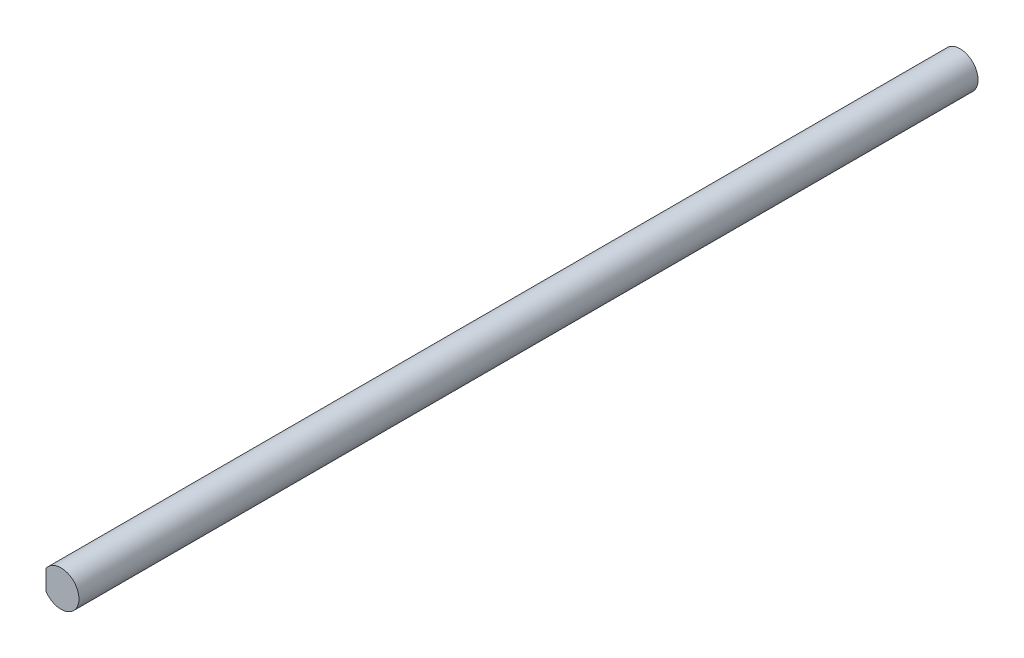
ISO-10303-21;
HEADER;
FILE_DESCRIPTION(('STEP AP214'),'2;1');
FILE_NAME('part.step','',(''),(''),'','','');
FILE_SCHEMA(('AUTOMOTIVE_DESIGN { 1 0 10303 214 1 1 1 1 }'));
ENDSEC;
DATA;
#1=APPLICATION_CONTEXT('core data for automotive mechanical design processes');
#2=APPLICATION_PROTOCOL_DEFINITION('international standard','automotive_design',2000,#1);
#3=PRODUCT_CONTEXT('',#1,'mechanical');
#4=PRODUCT('Part','Part','',(#3));
#5=PRODUCT_RELATED_PRODUCT_CATEGORY('part','',(#4));
#6=PRODUCT_DEFINITION_FORMATION('','',#4);
#7=PRODUCT_DEFINITION_CONTEXT('part definition',#1,'design');
#8=PRODUCT_DEFINITION('design','',#6,#7);
#9=PRODUCT_DEFINITION_SHAPE('','',#8);
#10=(LENGTH_UNIT() NAMED_UNIT(*) SI_UNIT(.MILLI.,.METRE.));
#11=(NAMED_UNIT(*) PLANE_ANGLE_UNIT() SI_UNIT($,.RADIAN.));
#12=(NAMED_UNIT(*) SI_UNIT($,.STERADIAN.) SOLID_ANGLE_UNIT());
#13=UNCERTAINTY_MEASURE_WITH_UNIT(LENGTH_MEASURE(1.E-05),#10,'distance_accuracy_value','');
#14=(GEOMETRIC_REPRESENTATION_CONTEXT(3) GLOBAL_UNCERTAINTY_ASSIGNED_CONTEXT((#13)) GLOBAL_UNIT_ASSIGNED_CONTEXT((#10,
#11,#12)) REPRESENTATION_CONTEXT('',''));
#15=CARTESIAN_POINT('',(0.,0.,0.));
#16=DIRECTION('',(0.,0.,1.));
#17=DIRECTION('',(1.,0.,0.));
#18=AXIS2_PLACEMENT_3D('',#15,#16,#17);
#19=CARTESIAN_POINT('',(0.,0.,150.));
#20=DIRECTION('',(0.,0.,-1.));
#21=DIRECTION('',(-1.,0.,0.));
#22=AXIS2_PLACEMENT_3D('',#19,#20,#21);
#23=CYLINDRICAL_SURFACE('',#22,3.);
#24=CARTESIAN_POINT('',(0.,0.,0.));
#25=DIRECTION('',(0.,0.,1.));
#26=DIRECTION('',(1.,0.,0.));
#27=AXIS2_PLACEMENT_3D('',#24,#25,#26);
#28=CIRCLE('',#27,3.);
#29=CARTESIAN_POINT('',(-2.5,-1.6583123951777,0.));
#30=VERTEX_POINT('',#29);
#31=CARTESIAN_POINT('',(-2.5,1.6583123951777,0.));
#32=VERTEX_POINT('',#31);
#33=EDGE_CURVE('E70',#30,#32,#28,.T.);
#34=ORIENTED_EDGE('',*,*,#33,.T.);
#35=DIRECTION('',(0.,0.,-1.));
#36=VECTOR('',#35,1.);
#37=CARTESIAN_POINT('',(-2.5,1.6583123951777,150.));
#38=LINE('',#37,#36);
#39=CARTESIAN_POINT('',(-2.5,1.6583123951777,150.));
#40=VERTEX_POINT('',#39);
#41=EDGE_CURVE('E11',#40,#32,#38,.T.);
#42=ORIENTED_EDGE('',*,*,#41,.F.);
#43=CARTESIAN_POINT('',(0.,0.,150.));
#44=DIRECTION('',(0.,0.,1.));
#45=DIRECTION('',(1.,0.,0.));
#46=AXIS2_PLACEMENT_3D('',#43,#44,#45);
#47=CIRCLE('',#46,3.);
#48=CARTESIAN_POINT('',(-2.5,-1.6583123951777,150.));
#49=VERTEX_POINT('',#48);
#50=EDGE_CURVE('E69',#49,#40,#47,.T.);
#51=ORIENTED_EDGE('',*,*,#50,.F.);
#52=DIRECTION('',(0.,0.,-1.));
#53=VECTOR('',#52,1.);
#54=CARTESIAN_POINT('',(-2.5,-1.6583123951777,150.));
#55=LINE('',#54,#53);
#56=EDGE_CURVE('E46',#49,#30,#55,.T.);
#57=ORIENTED_EDGE('',*,*,#56,.T.);
#58=EDGE_LOOP('',(#34,#42,#51,#57));
#59=FACE_BOUND('',#58,.T.);
#60=ADVANCED_FACE('F37',(#59),#23,.T.);
#61=CARTESIAN_POINT('',(-2.5,1.6583123951777,150.));
#62=DIRECTION('',(1.,0.,0.));
#63=DIRECTION('',(0.,0.,-1.));
#64=AXIS2_PLACEMENT_3D('',#61,#62,#63);
#65=PLANE('',#64);
#66=DIRECTION('',(0.,-1.,0.));
#67=VECTOR('',#66,1.);
#68=CARTESIAN_POINT('',(-2.5,1.6583123951777,0.));
#69=LINE('',#68,#67);
#70=EDGE_CURVE('E61',#32,#30,#69,.T.);
#71=ORIENTED_EDGE('',*,*,#70,.T.);
#72=ORIENTED_EDGE('',*,*,#56,.F.);
#73=DIRECTION('',(0.,-1.,0.));
#74=VECTOR('',#73,1.);
#75=CARTESIAN_POINT('',(-2.5,1.6583123951777,150.));
#76=LINE('',#75,#74);
#77=EDGE_CURVE('E53',#40,#49,#76,.T.);
#78=ORIENTED_EDGE('',*,*,#77,.F.);
#79=ORIENTED_EDGE('',*,*,#41,.T.);
#80=EDGE_LOOP('',(#71,#72,#78,#79));
#81=FACE_BOUND('',#80,.T.);
#82=ADVANCED_FACE('F64',(#81),#65,.F.);
#83=CARTESIAN_POINT('',(0.,0.,150.));
#84=DIRECTION('',(0.,0.,1.));
#85=DIRECTION('',(1.,0.,0.));
#86=AXIS2_PLACEMENT_3D('',#83,#84,#85);
#87=PLANE('',#86);
#88=ORIENTED_EDGE('',*,*,#50,.T.);
#89=ORIENTED_EDGE('',*,*,#77,.T.);
#90=EDGE_LOOP('',(#88,#89));
#91=FACE_BOUND('',#90,.T.);
#92=ADVANCED_FACE('F81',(#91),#87,.T.);
#93=CARTESIAN_POINT('',(0.,0.,0.));
#94=DIRECTION('',(0.,0.,1.));
#95=DIRECTION('',(1.,0.,0.));
#96=AXIS2_PLACEMENT_3D('',#93,#94,#95);
#97=PLANE('',#96);
#98=ORIENTED_EDGE('',*,*,#33,.F.);
#99=ORIENTED_EDGE('',*,*,#70,.F.);
#100=EDGE_LOOP('',(#98,#99));
#101=FACE_BOUND('',#100,.T.);
#102=ADVANCED_FACE('F74',(#101),#97,.F.);
#103=CLOSED_SHELL('',(#60,#82,#92,#102));
#104=MANIFOLD_SOLID_BREP('B2',#103);
#105=ADVANCED_BREP_SHAPE_REPRESENTATION('',(#18,#104),#14);
#106=SHAPE_DEFINITION_REPRESENTATION(#9,#105);
ENDSEC;
END-ISO-10303-21;
